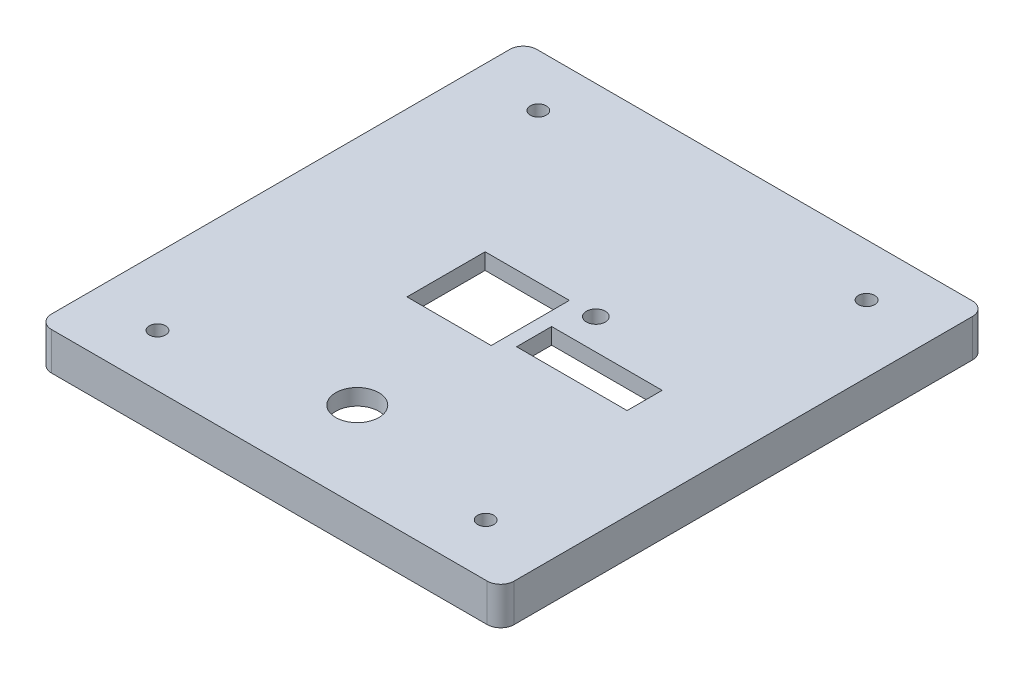
ISO-10303-21;
HEADER;
FILE_DESCRIPTION(('STEP AP214'),'2;1');
FILE_NAME('part.step','',(''),(''),'','','');
FILE_SCHEMA(('AUTOMOTIVE_DESIGN { 1 0 10303 214 1 1 1 1 }'));
ENDSEC;
DATA;
#1=APPLICATION_CONTEXT('core data for automotive mechanical design processes');
#2=APPLICATION_PROTOCOL_DEFINITION('international standard','automotive_design',2000,#1);
#3=PRODUCT_CONTEXT('',#1,'mechanical');
#4=PRODUCT('Part','Part','',(#3));
#5=PRODUCT_RELATED_PRODUCT_CATEGORY('part','',(#4));
#6=PRODUCT_DEFINITION_FORMATION('','',#4);
#7=PRODUCT_DEFINITION_CONTEXT('part definition',#1,'design');
#8=PRODUCT_DEFINITION('design','',#6,#7);
#9=PRODUCT_DEFINITION_SHAPE('','',#8);
#10=(LENGTH_UNIT() NAMED_UNIT(*) SI_UNIT(.MILLI.,.METRE.));
#11=(NAMED_UNIT(*) PLANE_ANGLE_UNIT() SI_UNIT($,.RADIAN.));
#12=(NAMED_UNIT(*) SI_UNIT($,.STERADIAN.) SOLID_ANGLE_UNIT());
#13=UNCERTAINTY_MEASURE_WITH_UNIT(LENGTH_MEASURE(1.E-05),#10,'distance_accuracy_value','');
#14=(GEOMETRIC_REPRESENTATION_CONTEXT(3) GLOBAL_UNCERTAINTY_ASSIGNED_CONTEXT((#13)) GLOBAL_UNIT_ASSIGNED_CONTEXT((#10,
#11,#12)) REPRESENTATION_CONTEXT('',''));
#15=CARTESIAN_POINT('',(0.,0.,0.));
#16=DIRECTION('',(0.,0.,1.));
#17=DIRECTION('',(1.,0.,0.));
#18=AXIS2_PLACEMENT_3D('',#15,#16,#17);
#19=CARTESIAN_POINT('',(0.,4.,0.));
#20=DIRECTION('',(0.,1.,0.));
#21=DIRECTION('',(0.,0.,1.));
#22=AXIS2_PLACEMENT_3D('',#19,#20,#21);
#23=PLANE('',#22);
#24=CARTESIAN_POINT('',(68.7039801841855,4.,-4.81909110229253));
#25=DIRECTION('',(0.,1.,0.));
#26=DIRECTION('',(0.,0.,1.));
#27=AXIS2_PLACEMENT_3D('',#24,#25,#26);
#28=CIRCLE('',#27,1.50000000000001);
#29=CARTESIAN_POINT('',(68.7039801841855,4.,-3.31909110229252));
#30=VERTEX_POINT('',#29);
#31=EDGE_CURVE('E539',#30,#30,#28,.T.);
#32=ORIENTED_EDGE('',*,*,#31,.T.);
#33=EDGE_LOOP('',(#32));
#34=FACE_BOUND('',#33,.T.);
#35=CARTESIAN_POINT('',(7.82598018418551,4.,-75.4570911022925));
#36=DIRECTION('',(0.,1.,0.));
#37=DIRECTION('',(0.,0.,1.));
#38=AXIS2_PLACEMENT_3D('',#35,#36,#37);
#39=CIRCLE('',#38,1.5);
#40=CARTESIAN_POINT('',(7.82598018418551,4.,-73.9570911022925));
#41=VERTEX_POINT('',#40);
#42=EDGE_CURVE('E753',#41,#41,#39,.T.);
#43=ORIENTED_EDGE('',*,*,#42,.T.);
#44=EDGE_LOOP('',(#43));
#45=FACE_BOUND('',#44,.T.);
#46=CARTESIAN_POINT('',(38.353887366001,4.,-11.3565708229402));
#47=DIRECTION('',(0.,1.,0.));
#48=DIRECTION('',(0.,0.,1.));
#49=AXIS2_PLACEMENT_3D('',#46,#47,#48);
#50=CIRCLE('',#49,4.00000000000001);
#51=CARTESIAN_POINT('',(38.353887366001,4.,-7.35657082294016));
#52=VERTEX_POINT('',#51);
#53=EDGE_CURVE('E544',#52,#52,#50,.T.);
#54=ORIENTED_EDGE('',*,*,#53,.T.);
#55=EDGE_LOOP('',(#54));
#56=FACE_BOUND('',#55,.T.);
#57=DIRECTION('',(-1.,0.,0.));
#58=VECTOR('',#57,1.);
#59=CARTESIAN_POINT('',(0.,4.,-47.8380911022925));
#60=LINE('',#59,#58);
#61=CARTESIAN_POINT('',(41.2049801841855,4.,-47.8380911022925));
#62=VERTEX_POINT('',#61);
#63=CARTESIAN_POINT('',(25.5839801841855,4.,-47.8380911022925));
#64=VERTEX_POINT('',#63);
#65=EDGE_CURVE('E240',#62,#64,#60,.T.);
#66=ORIENTED_EDGE('',*,*,#65,.T.);
#67=DIRECTION('',(0.,0.,1.));
#68=VECTOR('',#67,1.);
#69=CARTESIAN_POINT('',(25.5839801841855,4.,0.));
#70=LINE('',#69,#68);
#71=CARTESIAN_POINT('',(25.5839801841855,4.,-33.3380911022925));
#72=VERTEX_POINT('',#71);
#73=EDGE_CURVE('E244',#64,#72,#70,.T.);
#74=ORIENTED_EDGE('',*,*,#73,.T.);
#75=DIRECTION('',(1.,0.,0.));
#76=VECTOR('',#75,1.);
#77=CARTESIAN_POINT('',(0.,4.,-33.3380911022925));
#78=LINE('',#77,#76);
#79=CARTESIAN_POINT('',(41.2049801841855,4.,-33.3380911022925));
#80=VERTEX_POINT('',#79);
#81=EDGE_CURVE('E231',#72,#80,#78,.T.);
#82=ORIENTED_EDGE('',*,*,#81,.T.);
#83=DIRECTION('',(0.,0.,-1.));
#84=VECTOR('',#83,1.);
#85=CARTESIAN_POINT('',(41.2049801841855,4.,0.));
#86=LINE('',#85,#84);
#87=EDGE_CURVE('E206',#80,#62,#86,.T.);
#88=ORIENTED_EDGE('',*,*,#87,.T.);
#89=EDGE_LOOP('',(#66,#74,#82,#88));
#90=FACE_BOUND('',#89,.T.);
#91=CARTESIAN_POINT('',(46.2649801841855,4.,-47.6880911022925));
#92=DIRECTION('',(0.,1.,0.));
#93=DIRECTION('',(0.,0.,1.));
#94=AXIS2_PLACEMENT_3D('',#91,#92,#93);
#95=CIRCLE('',#94,1.75);
#96=CARTESIAN_POINT('',(46.2649801841855,4.,-45.9380911022925));
#97=VERTEX_POINT('',#96);
#98=EDGE_CURVE('E252',#97,#97,#95,.T.);
#99=ORIENTED_EDGE('',*,*,#98,.T.);
#100=EDGE_LOOP('',(#99));
#101=FACE_BOUND('',#100,.T.);
#102=DIRECTION('',(0.,0.,-1.));
#103=VECTOR('',#102,1.);
#104=CARTESIAN_POINT('',(64.2549801841856,4.,-1.371872277833E-13));
#105=LINE('',#104,#103);
#106=CARTESIAN_POINT('',(64.2549801841855,4.,-35.4980911022925));
#107=VERTEX_POINT('',#106);
#108=CARTESIAN_POINT('',(64.2549801841855,4.,-41.9980911022925));
#109=VERTEX_POINT('',#108);
#110=EDGE_CURVE('E292',#107,#109,#105,.T.);
#111=ORIENTED_EDGE('',*,*,#110,.T.);
#112=DIRECTION('',(-1.,0.,0.));
#113=VECTOR('',#112,1.);
#114=CARTESIAN_POINT('',(0.,4.,-41.9980911022925));
#115=LINE('',#114,#113);
#116=CARTESIAN_POINT('',(43.7549801841855,4.,-41.9980911022925));
#117=VERTEX_POINT('',#116);
#118=EDGE_CURVE('E296',#109,#117,#115,.T.);
#119=ORIENTED_EDGE('',*,*,#118,.T.);
#120=DIRECTION('',(0.,0.,1.));
#121=VECTOR('',#120,1.);
#122=CARTESIAN_POINT('',(43.7549801841855,4.,0.));
#123=LINE('',#122,#121);
#124=CARTESIAN_POINT('',(43.7549801841855,4.,-35.4980911022925));
#125=VERTEX_POINT('',#124);
#126=EDGE_CURVE('E275',#117,#125,#123,.T.);
#127=ORIENTED_EDGE('',*,*,#126,.T.);
#128=DIRECTION('',(1.,0.,0.));
#129=VECTOR('',#128,1.);
#130=CARTESIAN_POINT('',(0.,4.,-35.4980911022925));
#131=LINE('',#130,#129);
#132=EDGE_CURVE('E288',#125,#107,#131,.T.);
#133=ORIENTED_EDGE('',*,*,#132,.T.);
#134=EDGE_LOOP('',(#111,#119,#127,#133));
#135=FACE_BOUND('',#134,.T.);
#136=DIRECTION('',(-1.,0.,0.));
#137=VECTOR('',#136,1.);
#138=CARTESIAN_POINT('',(5.62598018418551,4.,-77.8570911022925));
#139=LINE('',#138,#137);
#140=CARTESIAN_POINT('',(70.9039801841855,4.,-77.8570911022925));
#141=VERTEX_POINT('',#140);
#142=CARTESIAN_POINT('',(5.62598018418551,4.,-77.8570911022925));
#143=VERTEX_POINT('',#142);
#144=EDGE_CURVE('E357',#141,#143,#139,.T.);
#145=ORIENTED_EDGE('',*,*,#144,.F.);
#146=DIRECTION('',(0.,0.,-1.));
#147=VECTOR('',#146,1.);
#148=CARTESIAN_POINT('',(70.9039801841855,4.,-77.8570911022925));
#149=LINE('',#148,#147);
#150=CARTESIAN_POINT('',(70.9039801841855,4.,-2.41909110229249));
#151=VERTEX_POINT('',#150);
#152=EDGE_CURVE('E353',#151,#141,#149,.T.);
#153=ORIENTED_EDGE('',*,*,#152,.F.);
#154=DIRECTION('',(1.,0.,0.));
#155=VECTOR('',#154,1.);
#156=CARTESIAN_POINT('',(5.62598018418552,4.,-2.41909110229249));
#157=LINE('',#156,#155);
#158=CARTESIAN_POINT('',(5.62598018418552,4.,-2.41909110229249));
#159=VERTEX_POINT('',#158);
#160=EDGE_CURVE('E366',#159,#151,#157,.T.);
#161=ORIENTED_EDGE('',*,*,#160,.F.);
#162=DIRECTION('',(0.,0.,1.));
#163=VECTOR('',#162,1.);
#164=CARTESIAN_POINT('',(5.62598018418551,4.,-77.8570911022925));
#165=LINE('',#164,#163);
#166=EDGE_CURVE('E362',#143,#159,#165,.T.);
#167=ORIENTED_EDGE('',*,*,#166,.F.);
#168=EDGE_LOOP('',(#145,#153,#161,#167));
#169=FACE_BOUND('',#168,.T.);
#170=CARTESIAN_POINT('',(7.82598018418551,4.,-4.81909110229255));
#171=DIRECTION('',(0.,1.,0.));
#172=DIRECTION('',(0.,0.,1.));
#173=AXIS2_PLACEMENT_3D('',#170,#171,#172);
#174=CIRCLE('',#173,1.5);
#175=CARTESIAN_POINT('',(7.82598018418551,4.,-3.31909110229254));
#176=VERTEX_POINT('',#175);
#177=EDGE_CURVE('E532',#176,#176,#174,.F.);
#178=ORIENTED_EDGE('',*,*,#177,.F.);
#179=EDGE_LOOP('',(#178));
#180=FACE_BOUND('',#179,.T.);
#181=CARTESIAN_POINT('',(68.7039801841855,4.,-75.4570911022925));
#182=DIRECTION('',(0.,1.,0.));
#183=DIRECTION('',(0.,0.,1.));
#184=AXIS2_PLACEMENT_3D('',#181,#182,#183);
#185=CIRCLE('',#184,1.50000000000001);
#186=CARTESIAN_POINT('',(68.7039801841855,4.,-73.9570911022925));
#187=VERTEX_POINT('',#186);
#188=EDGE_CURVE('E535',#187,#187,#185,.F.);
#189=ORIENTED_EDGE('',*,*,#188,.F.);
#190=EDGE_LOOP('',(#189));
#191=FACE_BOUND('',#190,.T.);
#192=ADVANCED_FACE('F39',(#34,#45,#56,#90,#101,#135,#169,#180,#191),#23,.F.);
#193=CARTESIAN_POINT('',(0.,7.,0.));
#194=DIRECTION('',(0.,1.,0.));
#195=DIRECTION('',(0.,0.,1.));
#196=AXIS2_PLACEMENT_3D('',#193,#194,#195);
#197=PLANE('',#196);
#198=CARTESIAN_POINT('',(7.82598018418551,7.,-4.81909110229255));
#199=DIRECTION('',(0.,-1.,0.));
#200=DIRECTION('',(0.,0.,-1.));
#201=AXIS2_PLACEMENT_3D('',#198,#199,#200);
#202=CIRCLE('',#201,1.5);
#203=CARTESIAN_POINT('',(7.82598018418551,7.,-6.31909110229255));
#204=VERTEX_POINT('',#203);
#205=EDGE_CURVE('E745',#204,#204,#202,.T.);
#206=ORIENTED_EDGE('',*,*,#205,.T.);
#207=EDGE_LOOP('',(#206));
#208=FACE_BOUND('',#207,.T.);
#209=CARTESIAN_POINT('',(7.82598018418551,7.,-75.4570911022925));
#210=DIRECTION('',(0.,1.,0.));
#211=DIRECTION('',(0.,0.,1.));
#212=AXIS2_PLACEMENT_3D('',#209,#210,#211);
#213=CIRCLE('',#212,1.5);
#214=CARTESIAN_POINT('',(7.82598018418551,7.,-73.9570911022925));
#215=VERTEX_POINT('',#214);
#216=EDGE_CURVE('E749',#215,#215,#213,.T.);
#217=ORIENTED_EDGE('',*,*,#216,.F.);
#218=EDGE_LOOP('',(#217));
#219=FACE_BOUND('',#218,.T.);
#220=CARTESIAN_POINT('',(38.353887366001,7.,-11.3565708229402));
#221=DIRECTION('',(0.,1.,0.));
#222=DIRECTION('',(0.,0.,1.));
#223=AXIS2_PLACEMENT_3D('',#220,#221,#222);
#224=CIRCLE('',#223,4.00000000000001);
#225=CARTESIAN_POINT('',(38.353887366001,7.,-7.35657082294016));
#226=VERTEX_POINT('',#225);
#227=EDGE_CURVE('E538',#226,#226,#224,.T.);
#228=ORIENTED_EDGE('',*,*,#227,.F.);
#229=EDGE_LOOP('',(#228));
#230=FACE_BOUND('',#229,.T.);
#231=DIRECTION('',(0.,0.,1.));
#232=VECTOR('',#231,1.);
#233=CARTESIAN_POINT('',(25.5839801841855,7.,-33.3380911022925));
#234=LINE('',#233,#232);
#235=CARTESIAN_POINT('',(25.5839801841855,7.,-47.8380911022925));
#236=VERTEX_POINT('',#235);
#237=CARTESIAN_POINT('',(25.5839801841855,7.,-33.3380911022925));
#238=VERTEX_POINT('',#237);
#239=EDGE_CURVE('E63',#236,#238,#234,.T.);
#240=ORIENTED_EDGE('',*,*,#239,.F.);
#241=DIRECTION('',(-1.,0.,0.));
#242=VECTOR('',#241,1.);
#243=CARTESIAN_POINT('',(25.5839801841855,7.,-47.8380911022925));
#244=LINE('',#243,#242);
#245=CARTESIAN_POINT('',(41.2049801841855,7.,-47.8380911022925));
#246=VERTEX_POINT('',#245);
#247=EDGE_CURVE('E221',#246,#236,#244,.T.);
#248=ORIENTED_EDGE('',*,*,#247,.F.);
#249=DIRECTION('',(0.,0.,-1.));
#250=VECTOR('',#249,1.);
#251=CARTESIAN_POINT('',(41.2049801841855,7.,-47.8380911022925));
#252=LINE('',#251,#250);
#253=CARTESIAN_POINT('',(41.2049801841855,7.,-33.3380911022925));
#254=VERTEX_POINT('',#253);
#255=EDGE_CURVE('E203',#254,#246,#252,.T.);
#256=ORIENTED_EDGE('',*,*,#255,.F.);
#257=DIRECTION('',(1.,0.,0.));
#258=VECTOR('',#257,1.);
#259=CARTESIAN_POINT('',(41.2049801841855,7.,-33.3380911022925));
#260=LINE('',#259,#258);
#261=EDGE_CURVE('E213',#238,#254,#260,.T.);
#262=ORIENTED_EDGE('',*,*,#261,.F.);
#263=EDGE_LOOP('',(#240,#248,#256,#262));
#264=FACE_BOUND('',#263,.T.);
#265=CARTESIAN_POINT('',(46.2649801841855,7.,-47.6880911022925));
#266=DIRECTION('',(0.,1.,0.));
#267=DIRECTION('',(0.,0.,1.));
#268=AXIS2_PLACEMENT_3D('',#265,#266,#267);
#269=CIRCLE('',#268,1.75);
#270=CARTESIAN_POINT('',(46.2649801841855,7.,-45.9380911022925));
#271=VERTEX_POINT('',#270);
#272=EDGE_CURVE('E248',#271,#271,#269,.T.);
#273=ORIENTED_EDGE('',*,*,#272,.F.);
#274=EDGE_LOOP('',(#273));
#275=FACE_BOUND('',#274,.T.);
#276=DIRECTION('',(-1.,0.,0.));
#277=VECTOR('',#276,1.);
#278=CARTESIAN_POINT('',(64.2549801841855,7.,-41.9980911022925));
#279=LINE('',#278,#277);
#280=CARTESIAN_POINT('',(64.2549801841855,7.,-41.9980911022925));
#281=VERTEX_POINT('',#280);
#282=CARTESIAN_POINT('',(43.7549801841855,7.,-41.9980911022925));
#283=VERTEX_POINT('',#282);
#284=EDGE_CURVE('E268',#281,#283,#279,.T.);
#285=ORIENTED_EDGE('',*,*,#284,.F.);
#286=DIRECTION('',(0.,0.,-1.));
#287=VECTOR('',#286,1.);
#288=CARTESIAN_POINT('',(64.2549801841855,7.,-41.9980911022925));
#289=LINE('',#288,#287);
#290=CARTESIAN_POINT('',(64.2549801841855,7.,-35.4980911022925));
#291=VERTEX_POINT('',#290);
#292=EDGE_CURVE('E264',#291,#281,#289,.T.);
#293=ORIENTED_EDGE('',*,*,#292,.F.);
#294=DIRECTION('',(1.,0.,0.));
#295=VECTOR('',#294,1.);
#296=CARTESIAN_POINT('',(64.2549801841855,7.,-35.4980911022925));
#297=LINE('',#296,#295);
#298=CARTESIAN_POINT('',(43.7549801841855,7.,-35.4980911022925));
#299=VERTEX_POINT('',#298);
#300=EDGE_CURVE('E260',#299,#291,#297,.T.);
#301=ORIENTED_EDGE('',*,*,#300,.F.);
#302=DIRECTION('',(0.,0.,1.));
#303=VECTOR('',#302,1.);
#304=CARTESIAN_POINT('',(43.7549801841855,7.,-35.4980911022925));
#305=LINE('',#304,#303);
#306=EDGE_CURVE('E256',#283,#299,#305,.T.);
#307=ORIENTED_EDGE('',*,*,#306,.F.);
#308=EDGE_LOOP('',(#285,#293,#301,#307));
#309=FACE_BOUND('',#308,.T.);
#310=DIRECTION('',(0.,0.,-1.));
#311=VECTOR('',#310,1.);
#312=CARTESIAN_POINT('',(81.1649801841855,7.,-85.1380911022925));
#313=LINE('',#312,#311);
#314=CARTESIAN_POINT('',(81.1649801841855,7.,2.36190889770745));
#315=VERTEX_POINT('',#314);
#316=CARTESIAN_POINT('',(81.1649801841855,7.,-82.6380911022925));
#317=VERTEX_POINT('',#316);
#318=EDGE_CURVE('E344',#315,#317,#313,.T.);
#319=ORIENTED_EDGE('',*,*,#318,.T.);
#320=CARTESIAN_POINT('',(78.6649801841855,7.,-82.6380911022925));
#321=DIRECTION('',(0.,1.,0.));
#322=DIRECTION('',(0.,0.,1.));
#323=AXIS2_PLACEMENT_3D('',#320,#321,#322);
#324=CIRCLE('',#323,2.5);
#325=CARTESIAN_POINT('',(78.6649801841855,7.,-85.1380911022925));
#326=VERTEX_POINT('',#325);
#327=EDGE_CURVE('E451',#317,#326,#324,.T.);
#328=ORIENTED_EDGE('',*,*,#327,.T.);
#329=DIRECTION('',(-1.,0.,0.));
#330=VECTOR('',#329,1.);
#331=CARTESIAN_POINT('',(-4.63501981581449,7.,-85.1380911022925));
#332=LINE('',#331,#330);
#333=CARTESIAN_POINT('',(-2.13501981581449,7.,-85.1380911022925));
#334=VERTEX_POINT('',#333);
#335=EDGE_CURVE('E348',#326,#334,#332,.T.);
#336=ORIENTED_EDGE('',*,*,#335,.T.);
#337=CARTESIAN_POINT('',(-2.13501981581449,7.,-82.6380911022925));
#338=DIRECTION('',(0.,1.,0.));
#339=DIRECTION('',(0.,0.,1.));
#340=AXIS2_PLACEMENT_3D('',#337,#338,#339);
#341=CIRCLE('',#340,2.5);
#342=CARTESIAN_POINT('',(-4.63501981581449,7.,-82.6380911022925));
#343=VERTEX_POINT('',#342);
#344=EDGE_CURVE('E448',#334,#343,#341,.T.);
#345=ORIENTED_EDGE('',*,*,#344,.T.);
#346=DIRECTION('',(0.,0.,1.));
#347=VECTOR('',#346,1.);
#348=CARTESIAN_POINT('',(-4.63501981581449,7.,-85.1380911022925));
#349=LINE('',#348,#347);
#350=CARTESIAN_POINT('',(-4.63501981581449,7.,2.36190889770746));
#351=VERTEX_POINT('',#350);
#352=EDGE_CURVE('E325',#343,#351,#349,.T.);
#353=ORIENTED_EDGE('',*,*,#352,.T.);
#354=CARTESIAN_POINT('',(-2.13501981581448,7.,2.36190889770749));
#355=DIRECTION('',(0.,1.,0.));
#356=DIRECTION('',(0.,0.,1.));
#357=AXIS2_PLACEMENT_3D('',#354,#355,#356);
#358=CIRCLE('',#357,2.5);
#359=CARTESIAN_POINT('',(-2.13501981581448,7.,4.86190889770748));
#360=VERTEX_POINT('',#359);
#361=EDGE_CURVE('E442',#351,#360,#358,.T.);
#362=ORIENTED_EDGE('',*,*,#361,.T.);
#363=DIRECTION('',(1.,0.,0.));
#364=VECTOR('',#363,1.);
#365=CARTESIAN_POINT('',(-4.63501981581449,7.,4.86190889770748));
#366=LINE('',#365,#364);
#367=CARTESIAN_POINT('',(78.6649801841855,7.,4.86190889770748));
#368=VERTEX_POINT('',#367);
#369=EDGE_CURVE('E340',#360,#368,#366,.T.);
#370=ORIENTED_EDGE('',*,*,#369,.T.);
#371=CARTESIAN_POINT('',(78.6649801841855,7.,2.36190889770747));
#372=DIRECTION('',(0.,1.,0.));
#373=DIRECTION('',(0.,0.,1.));
#374=AXIS2_PLACEMENT_3D('',#371,#372,#373);
#375=CIRCLE('',#374,2.5);
#376=EDGE_CURVE('E445',#368,#315,#375,.T.);
#377=ORIENTED_EDGE('',*,*,#376,.T.);
#378=EDGE_LOOP('',(#319,#328,#336,#345,#353,#362,#370,#377));
#379=FACE_BOUND('',#378,.T.);
#380=CARTESIAN_POINT('',(68.7039801841855,7.,-4.81909110229253));
#381=DIRECTION('',(0.,1.,0.));
#382=DIRECTION('',(0.,0.,1.));
#383=AXIS2_PLACEMENT_3D('',#380,#381,#382);
#384=CIRCLE('',#383,1.50000000000001);
#385=CARTESIAN_POINT('',(68.7039801841855,7.,-3.31909110229252));
#386=VERTEX_POINT('',#385);
#387=EDGE_CURVE('E741',#386,#386,#384,.T.);
#388=ORIENTED_EDGE('',*,*,#387,.F.);
#389=EDGE_LOOP('',(#388));
#390=FACE_BOUND('',#389,.T.);
#391=CARTESIAN_POINT('',(68.7039801841855,7.,-75.4570911022925));
#392=DIRECTION('',(0.,-1.,0.));
#393=DIRECTION('',(0.,0.,-1.));
#394=AXIS2_PLACEMENT_3D('',#391,#392,#393);
#395=CIRCLE('',#394,1.50000000000001);
#396=CARTESIAN_POINT('',(68.7039801841855,7.,-76.9570911022925));
#397=VERTEX_POINT('',#396);
#398=EDGE_CURVE('E738',#397,#397,#395,.T.);
#399=ORIENTED_EDGE('',*,*,#398,.T.);
#400=EDGE_LOOP('',(#399));
#401=FACE_BOUND('',#400,.T.);
#402=ADVANCED_FACE('F218',(#208,#219,#230,#264,#275,#309,#379,#390,#401),#197,.T.);
#403=CARTESIAN_POINT('',(0.,0.,0.));
#404=DIRECTION('',(0.,1.,0.));
#405=DIRECTION('',(0.,0.,1.));
#406=AXIS2_PLACEMENT_3D('',#403,#404,#405);
#407=PLANE('',#406);
#408=DIRECTION('',(-1.,0.,0.));
#409=VECTOR('',#408,1.);
#410=CARTESIAN_POINT('',(-4.63501981581449,0.,-85.1380911022925));
#411=LINE('',#410,#409);
#412=CARTESIAN_POINT('',(78.6649801841855,0.,-85.1380911022925));
#413=VERTEX_POINT('',#412);
#414=CARTESIAN_POINT('',(69.6970000041855,0.,-85.1380911022925));
#415=VERTEX_POINT('',#414);
#416=EDGE_CURVE('E413',#413,#415,#411,.T.);
#417=ORIENTED_EDGE('',*,*,#416,.F.);
#418=CARTESIAN_POINT('',(78.6649801841855,0.,-82.6380911022925));
#419=DIRECTION('',(0.,1.,0.));
#420=DIRECTION('',(0.,0.,1.));
#421=AXIS2_PLACEMENT_3D('',#418,#419,#420);
#422=CIRCLE('',#421,2.5);
#423=CARTESIAN_POINT('',(81.1649801841855,0.,-82.6380911022925));
#424=VERTEX_POINT('',#423);
#425=EDGE_CURVE('E432',#413,#424,#422,.F.);
#426=ORIENTED_EDGE('',*,*,#425,.T.);
#427=DIRECTION('',(0.,0.,-1.));
#428=VECTOR('',#427,1.);
#429=CARTESIAN_POINT('',(81.1649801841855,0.,-85.1380911022925));
#430=LINE('',#429,#428);
#431=CARTESIAN_POINT('',(81.1649801841855,0.,2.36190889770745));
#432=VERTEX_POINT('',#431);
#433=EDGE_CURVE('E408',#432,#424,#430,.T.);
#434=ORIENTED_EDGE('',*,*,#433,.F.);
#435=CARTESIAN_POINT('',(78.6649801841855,0.,2.36190889770747));
#436=DIRECTION('',(0.,1.,0.));
#437=DIRECTION('',(0.,0.,1.));
#438=AXIS2_PLACEMENT_3D('',#435,#436,#437);
#439=CIRCLE('',#438,2.5);
#440=CARTESIAN_POINT('',(78.6649801841855,0.,4.86190889770748));
#441=VERTEX_POINT('',#440);
#442=EDGE_CURVE('E426',#432,#441,#439,.F.);
#443=ORIENTED_EDGE('',*,*,#442,.T.);
#444=DIRECTION('',(1.,0.,0.));
#445=VECTOR('',#444,1.);
#446=CARTESIAN_POINT('',(-4.63501981581448,0.,4.86190889770749));
#447=LINE('',#446,#445);
#448=CARTESIAN_POINT('',(-2.13501981581448,0.,4.86190889770749));
#449=VERTEX_POINT('',#448);
#450=EDGE_CURVE('E404',#449,#441,#447,.T.);
#451=ORIENTED_EDGE('',*,*,#450,.F.);
#452=CARTESIAN_POINT('',(-2.13501981581448,0.,2.36190889770749));
#453=DIRECTION('',(0.,1.,0.));
#454=DIRECTION('',(0.,0.,1.));
#455=AXIS2_PLACEMENT_3D('',#452,#453,#454);
#456=CIRCLE('',#455,2.5);
#457=CARTESIAN_POINT('',(-4.63501981581448,0.,2.36190889770746));
#458=VERTEX_POINT('',#457);
#459=EDGE_CURVE('E423',#449,#458,#456,.F.);
#460=ORIENTED_EDGE('',*,*,#459,.T.);
#461=DIRECTION('',(0.,0.,1.));
#462=VECTOR('',#461,1.);
#463=CARTESIAN_POINT('',(-4.63501981581449,0.,-85.1380911022925));
#464=LINE('',#463,#462);
#465=CARTESIAN_POINT('',(-4.63501981581449,0.,-82.6380911022925));
#466=VERTEX_POINT('',#465);
#467=EDGE_CURVE('E400',#466,#458,#464,.T.);
#468=ORIENTED_EDGE('',*,*,#467,.F.);
#469=CARTESIAN_POINT('',(-2.13501981581449,0.,-82.6380911022925));
#470=DIRECTION('',(0.,1.,0.));
#471=DIRECTION('',(0.,0.,1.));
#472=AXIS2_PLACEMENT_3D('',#469,#470,#471);
#473=CIRCLE('',#472,2.5);
#474=CARTESIAN_POINT('',(-2.13501981581449,0.,-85.1380911022925));
#475=VERTEX_POINT('',#474);
#476=EDGE_CURVE('E429',#466,#475,#473,.F.);
#477=ORIENTED_EDGE('',*,*,#476,.T.);
#478=CARTESIAN_POINT('',(54.2970000041855,0.,-85.1380911022925));
#479=VERTEX_POINT('',#478);
#480=EDGE_CURVE('E412',#479,#475,#411,.T.);
#481=ORIENTED_EDGE('',*,*,#480,.F.);
#482=DIRECTION('',(0.,0.,-1.));
#483=VECTOR('',#482,1.);
#484=CARTESIAN_POINT('',(54.2970000041855,0.,-85.1380911022925));
#485=LINE('',#484,#483);
#486=CARTESIAN_POINT('',(54.2970000041855,0.,-77.8570911022925));
#487=VERTEX_POINT('',#486);
#488=EDGE_CURVE('E300',#487,#479,#485,.T.);
#489=ORIENTED_EDGE('',*,*,#488,.F.);
#490=DIRECTION('',(-1.,0.,0.));
#491=VECTOR('',#490,1.);
#492=CARTESIAN_POINT('',(5.62598018418551,0.,-77.8570911022925));
#493=LINE('',#492,#491);
#494=CARTESIAN_POINT('',(5.62598018418551,0.,-77.8570911022925));
#495=VERTEX_POINT('',#494);
#496=EDGE_CURVE('E374',#487,#495,#493,.T.);
#497=ORIENTED_EDGE('',*,*,#496,.T.);
#498=DIRECTION('',(0.,0.,1.));
#499=VECTOR('',#498,1.);
#500=CARTESIAN_POINT('',(5.62598018418551,0.,-77.8570911022925));
#501=LINE('',#500,#499);
#502=CARTESIAN_POINT('',(5.62598018418552,0.,-2.41909110229249));
#503=VERTEX_POINT('',#502);
#504=EDGE_CURVE('E379',#495,#503,#501,.T.);
#505=ORIENTED_EDGE('',*,*,#504,.T.);
#506=DIRECTION('',(1.,0.,0.));
#507=VECTOR('',#506,1.);
#508=CARTESIAN_POINT('',(5.62598018418552,0.,-2.41909110229249));
#509=LINE('',#508,#507);
#510=CARTESIAN_POINT('',(70.9039801841855,0.,-2.41909110229249));
#511=VERTEX_POINT('',#510);
#512=EDGE_CURVE('E358',#503,#511,#509,.T.);
#513=ORIENTED_EDGE('',*,*,#512,.T.);
#514=DIRECTION('',(0.,0.,-1.));
#515=VECTOR('',#514,1.);
#516=CARTESIAN_POINT('',(70.9039801841855,0.,-77.8570911022925));
#517=LINE('',#516,#515);
#518=CARTESIAN_POINT('',(70.9039801841855,0.,-77.8570911022925));
#519=VERTEX_POINT('',#518);
#520=EDGE_CURVE('E352',#511,#519,#517,.T.);
#521=ORIENTED_EDGE('',*,*,#520,.T.);
#522=CARTESIAN_POINT('',(69.6970000041855,0.,-77.8570911022925));
#523=VERTEX_POINT('',#522);
#524=EDGE_CURVE('E375',#519,#523,#493,.T.);
#525=ORIENTED_EDGE('',*,*,#524,.T.);
#526=DIRECTION('',(0.,0.,1.));
#527=VECTOR('',#526,1.);
#528=CARTESIAN_POINT('',(69.6970000041855,0.,-85.1380911022925));
#529=LINE('',#528,#527);
#530=EDGE_CURVE('E306',#415,#523,#529,.T.);
#531=ORIENTED_EDGE('',*,*,#530,.F.);
#532=EDGE_LOOP('',(#417,#426,#434,#443,#451,#460,#468,#477,#481,#489,#497,#505,#513,#521,#525,#531));
#533=FACE_BOUND('',#532,.T.);
#534=ADVANCED_FACE('F472',(#533),#407,.F.);
#535=CARTESIAN_POINT('',(-4.63501981581449,4.,-85.1380911022925));
#536=DIRECTION('',(1.,0.,0.));
#537=DIRECTION('',(0.,0.,-1.));
#538=AXIS2_PLACEMENT_3D('',#535,#536,#537);
#539=PLANE('',#538);
#540=ORIENTED_EDGE('',*,*,#352,.F.);
#541=DIRECTION('',(0.,-1.,0.));
#542=VECTOR('',#541,1.);
#543=CARTESIAN_POINT('',(-4.63501981581449,4.,-82.6380911022925));
#544=LINE('',#543,#542);
#545=EDGE_CURVE('E457',#343,#466,#544,.T.);
#546=ORIENTED_EDGE('',*,*,#545,.T.);
#547=ORIENTED_EDGE('',*,*,#467,.T.);
#548=DIRECTION('',(0.,-1.,0.));
#549=VECTOR('',#548,1.);
#550=CARTESIAN_POINT('',(-4.63501981581448,4.,2.36190889770749));
#551=LINE('',#550,#549);
#552=EDGE_CURVE('E454',#458,#351,#551,.F.);
#553=ORIENTED_EDGE('',*,*,#552,.T.);
#554=EDGE_LOOP('',(#540,#546,#547,#553));
#555=FACE_BOUND('',#554,.T.);
#556=ADVANCED_FACE('F621',(#555),#539,.F.);
#557=CARTESIAN_POINT('',(-4.63501981581448,4.,4.86190889770749));
#558=DIRECTION('',(0.,0.,-1.));
#559=DIRECTION('',(-1.,0.,0.));
#560=AXIS2_PLACEMENT_3D('',#557,#558,#559);
#561=PLANE('',#560);
#562=ORIENTED_EDGE('',*,*,#450,.T.);
#563=DIRECTION('',(0.,-1.,0.));
#564=VECTOR('',#563,1.);
#565=CARTESIAN_POINT('',(78.6649801841855,4.,4.86190889770748));
#566=LINE('',#565,#564);
#567=EDGE_CURVE('E11',#441,#368,#566,.F.);
#568=ORIENTED_EDGE('',*,*,#567,.T.);
#569=ORIENTED_EDGE('',*,*,#369,.F.);
#570=DIRECTION('',(0.,-1.,0.));
#571=VECTOR('',#570,1.);
#572=CARTESIAN_POINT('',(-2.13501981581448,4.,4.86190889770749));
#573=LINE('',#572,#571);
#574=EDGE_CURVE('E48',#360,#449,#573,.T.);
#575=ORIENTED_EDGE('',*,*,#574,.T.);
#576=EDGE_LOOP('',(#562,#568,#569,#575));
#577=FACE_BOUND('',#576,.T.);
#578=ADVANCED_FACE('F466',(#577),#561,.F.);
#579=CARTESIAN_POINT('',(81.1649801841855,4.,-85.1380911022925));
#580=DIRECTION('',(-1.,0.,0.));
#581=DIRECTION('',(0.,0.,1.));
#582=AXIS2_PLACEMENT_3D('',#579,#580,#581);
#583=PLANE('',#582);
#584=ORIENTED_EDGE('',*,*,#433,.T.);
#585=DIRECTION('',(0.,-1.,0.));
#586=VECTOR('',#585,1.);
#587=CARTESIAN_POINT('',(81.1649801841855,4.,-82.6380911022925));
#588=LINE('',#587,#586);
#589=EDGE_CURVE('E439',#424,#317,#588,.F.);
#590=ORIENTED_EDGE('',*,*,#589,.T.);
#591=ORIENTED_EDGE('',*,*,#318,.F.);
#592=DIRECTION('',(0.,-1.,0.));
#593=VECTOR('',#592,1.);
#594=CARTESIAN_POINT('',(81.1649801841855,4.,2.36190889770747));
#595=LINE('',#594,#593);
#596=EDGE_CURVE('E435',#315,#432,#595,.T.);
#597=ORIENTED_EDGE('',*,*,#596,.T.);
#598=EDGE_LOOP('',(#584,#590,#591,#597));
#599=FACE_BOUND('',#598,.T.);
#600=ADVANCED_FACE('F481',(#599),#583,.F.);
#601=CARTESIAN_POINT('',(-4.63501981581449,4.,-85.1380911022925));
#602=DIRECTION('',(0.,0.,1.));
#603=DIRECTION('',(1.,0.,0.));
#604=AXIS2_PLACEMENT_3D('',#601,#602,#603);
#605=PLANE('',#604);
#606=ORIENTED_EDGE('',*,*,#335,.F.);
#607=DIRECTION('',(0.,-1.,0.));
#608=VECTOR('',#607,1.);
#609=CARTESIAN_POINT('',(78.6649801841855,4.,-85.1380911022925));
#610=LINE('',#609,#608);
#611=EDGE_CURVE('E419',#326,#413,#610,.T.);
#612=ORIENTED_EDGE('',*,*,#611,.T.);
#613=ORIENTED_EDGE('',*,*,#416,.T.);
#614=DIRECTION('',(0.,-1.,0.));
#615=VECTOR('',#614,1.);
#616=CARTESIAN_POINT('',(69.6970000041855,3.,-85.1380911022925));
#617=LINE('',#616,#615);
#618=CARTESIAN_POINT('',(69.6970000041855,3.,-85.1380911022925));
#619=VERTEX_POINT('',#618);
#620=EDGE_CURVE('E330',#619,#415,#617,.T.);
#621=ORIENTED_EDGE('',*,*,#620,.F.);
#622=DIRECTION('',(1.,0.,0.));
#623=VECTOR('',#622,1.);
#624=CARTESIAN_POINT('',(69.6970000041855,3.,-85.1380911022925));
#625=LINE('',#624,#623);
#626=CARTESIAN_POINT('',(54.2970000041855,3.,-85.1380911022925));
#627=VERTEX_POINT('',#626);
#628=EDGE_CURVE('E305',#627,#619,#625,.T.);
#629=ORIENTED_EDGE('',*,*,#628,.F.);
#630=DIRECTION('',(0.,-1.,0.));
#631=VECTOR('',#630,1.);
#632=CARTESIAN_POINT('',(54.2970000041855,3.,-85.1380911022925));
#633=LINE('',#632,#631);
#634=EDGE_CURVE('E317',#627,#479,#633,.T.);
#635=ORIENTED_EDGE('',*,*,#634,.T.);
#636=ORIENTED_EDGE('',*,*,#480,.T.);
#637=DIRECTION('',(0.,-1.,0.));
#638=VECTOR('',#637,1.);
#639=CARTESIAN_POINT('',(-2.13501981581449,4.,-85.1380911022925));
#640=LINE('',#639,#638);
#641=EDGE_CURVE('E416',#475,#334,#640,.F.);
#642=ORIENTED_EDGE('',*,*,#641,.T.);
#643=EDGE_LOOP('',(#606,#612,#613,#621,#629,#635,#636,#642));
#644=FACE_BOUND('',#643,.T.);
#645=ADVANCED_FACE('F491',(#644),#605,.F.);
#646=CARTESIAN_POINT('',(70.9039801841855,4.,-77.8570911022925));
#647=DIRECTION('',(-1.,0.,0.));
#648=DIRECTION('',(0.,0.,1.));
#649=AXIS2_PLACEMENT_3D('',#646,#647,#648);
#650=PLANE('',#649);
#651=ORIENTED_EDGE('',*,*,#520,.F.);
#652=DIRECTION('',(0.,-1.,0.));
#653=VECTOR('',#652,1.);
#654=CARTESIAN_POINT('',(70.9039801841855,4.,-2.41909110229249));
#655=LINE('',#654,#653);
#656=EDGE_CURVE('E370',#151,#511,#655,.T.);
#657=ORIENTED_EDGE('',*,*,#656,.F.);
#658=ORIENTED_EDGE('',*,*,#152,.T.);
#659=DIRECTION('',(0.,-1.,0.));
#660=VECTOR('',#659,1.);
#661=CARTESIAN_POINT('',(70.9039801841855,4.,-77.8570911022925));
#662=LINE('',#661,#660);
#663=EDGE_CURVE('E396',#141,#519,#662,.T.);
#664=ORIENTED_EDGE('',*,*,#663,.T.);
#665=EDGE_LOOP('',(#651,#657,#658,#664));
#666=FACE_BOUND('',#665,.T.);
#667=ADVANCED_FACE('F523',(#666),#650,.T.);
#668=CARTESIAN_POINT('',(5.62598018418551,4.,-77.8570911022925));
#669=DIRECTION('',(0.,0.,1.));
#670=DIRECTION('',(1.,0.,0.));
#671=AXIS2_PLACEMENT_3D('',#668,#669,#670);
#672=PLANE('',#671);
#673=DIRECTION('',(0.,-1.,0.));
#674=VECTOR('',#673,1.);
#675=CARTESIAN_POINT('',(54.2970000041855,3.,-77.8570911022925));
#676=LINE('',#675,#674);
#677=CARTESIAN_POINT('',(54.2970000041855,3.,-77.8570911022925));
#678=VERTEX_POINT('',#677);
#679=EDGE_CURVE('E322',#678,#487,#676,.T.);
#680=ORIENTED_EDGE('',*,*,#679,.F.);
#681=DIRECTION('',(-1.,0.,0.));
#682=VECTOR('',#681,1.);
#683=CARTESIAN_POINT('',(54.2970000041855,3.,-77.8570911022925));
#684=LINE('',#683,#682);
#685=CARTESIAN_POINT('',(69.6970000041855,3.,-77.8570911022925));
#686=VERTEX_POINT('',#685);
#687=EDGE_CURVE('E313',#686,#678,#684,.T.);
#688=ORIENTED_EDGE('',*,*,#687,.F.);
#689=DIRECTION('',(0.,-1.,0.));
#690=VECTOR('',#689,1.);
#691=CARTESIAN_POINT('',(69.6970000041855,3.,-77.8570911022925));
#692=LINE('',#691,#690);
#693=EDGE_CURVE('E326',#686,#523,#692,.T.);
#694=ORIENTED_EDGE('',*,*,#693,.T.);
#695=ORIENTED_EDGE('',*,*,#524,.F.);
#696=ORIENTED_EDGE('',*,*,#663,.F.);
#697=ORIENTED_EDGE('',*,*,#144,.T.);
#698=DIRECTION('',(0.,-1.,0.));
#699=VECTOR('',#698,1.);
#700=CARTESIAN_POINT('',(5.62598018418551,4.,-77.8570911022925));
#701=LINE('',#700,#699);
#702=EDGE_CURVE('E392',#143,#495,#701,.T.);
#703=ORIENTED_EDGE('',*,*,#702,.T.);
#704=ORIENTED_EDGE('',*,*,#496,.F.);
#705=EDGE_LOOP('',(#680,#688,#694,#695,#696,#697,#703,#704));
#706=FACE_BOUND('',#705,.T.);
#707=ADVANCED_FACE('F500',(#706),#672,.T.);
#708=CARTESIAN_POINT('',(5.62598018418551,4.,-77.8570911022925));
#709=DIRECTION('',(1.,0.,0.));
#710=DIRECTION('',(0.,0.,-1.));
#711=AXIS2_PLACEMENT_3D('',#708,#709,#710);
#712=PLANE('',#711);
#713=ORIENTED_EDGE('',*,*,#504,.F.);
#714=ORIENTED_EDGE('',*,*,#702,.F.);
#715=ORIENTED_EDGE('',*,*,#166,.T.);
#716=DIRECTION('',(0.,-1.,0.));
#717=VECTOR('',#716,1.);
#718=CARTESIAN_POINT('',(5.62598018418552,4.,-2.41909110229249));
#719=LINE('',#718,#717);
#720=EDGE_CURVE('E389',#159,#503,#719,.T.);
#721=ORIENTED_EDGE('',*,*,#720,.T.);
#722=EDGE_LOOP('',(#713,#714,#715,#721));
#723=FACE_BOUND('',#722,.T.);
#724=ADVANCED_FACE('F516',(#723),#712,.T.);
#725=CARTESIAN_POINT('',(5.62598018418552,4.,-2.41909110229249));
#726=DIRECTION('',(0.,0.,-1.));
#727=DIRECTION('',(-1.,0.,0.));
#728=AXIS2_PLACEMENT_3D('',#725,#726,#727);
#729=PLANE('',#728);
#730=ORIENTED_EDGE('',*,*,#512,.F.);
#731=ORIENTED_EDGE('',*,*,#720,.F.);
#732=ORIENTED_EDGE('',*,*,#160,.T.);
#733=ORIENTED_EDGE('',*,*,#656,.T.);
#734=EDGE_LOOP('',(#730,#731,#732,#733));
#735=FACE_BOUND('',#734,.T.);
#736=ADVANCED_FACE('F520',(#735),#729,.T.);
#737=CARTESIAN_POINT('',(54.2970000041855,3.,-85.1380911022925));
#738=DIRECTION('',(-1.,0.,0.));
#739=DIRECTION('',(0.,0.,1.));
#740=AXIS2_PLACEMENT_3D('',#737,#738,#739);
#741=PLANE('',#740);
#742=ORIENTED_EDGE('',*,*,#488,.T.);
#743=ORIENTED_EDGE('',*,*,#634,.F.);
#744=DIRECTION('',(0.,0.,-1.));
#745=VECTOR('',#744,1.);
#746=CARTESIAN_POINT('',(54.2970000041855,3.,-85.1380911022925));
#747=LINE('',#746,#745);
#748=EDGE_CURVE('E301',#678,#627,#747,.T.);
#749=ORIENTED_EDGE('',*,*,#748,.F.);
#750=ORIENTED_EDGE('',*,*,#679,.T.);
#751=EDGE_LOOP('',(#742,#743,#749,#750));
#752=FACE_BOUND('',#751,.T.);
#753=ADVANCED_FACE('F605',(#752),#741,.F.);
#754=CARTESIAN_POINT('',(69.6970000041855,3.,-85.1380911022925));
#755=DIRECTION('',(1.,0.,0.));
#756=DIRECTION('',(0.,0.,-1.));
#757=AXIS2_PLACEMENT_3D('',#754,#755,#756);
#758=PLANE('',#757);
#759=ORIENTED_EDGE('',*,*,#530,.T.);
#760=ORIENTED_EDGE('',*,*,#693,.F.);
#761=DIRECTION('',(0.,0.,1.));
#762=VECTOR('',#761,1.);
#763=CARTESIAN_POINT('',(69.6970000041855,3.,-85.1380911022925));
#764=LINE('',#763,#762);
#765=EDGE_CURVE('E310',#619,#686,#764,.T.);
#766=ORIENTED_EDGE('',*,*,#765,.F.);
#767=ORIENTED_EDGE('',*,*,#620,.T.);
#768=EDGE_LOOP('',(#759,#760,#766,#767));
#769=FACE_BOUND('',#768,.T.);
#770=ADVANCED_FACE('F496',(#769),#758,.F.);
#771=CARTESIAN_POINT('',(0.,3.,0.));
#772=DIRECTION('',(0.,1.,0.));
#773=DIRECTION('',(0.,0.,1.));
#774=AXIS2_PLACEMENT_3D('',#771,#772,#773);
#775=PLANE('',#774);
#776=ORIENTED_EDGE('',*,*,#748,.T.);
#777=ORIENTED_EDGE('',*,*,#628,.T.);
#778=ORIENTED_EDGE('',*,*,#765,.T.);
#779=ORIENTED_EDGE('',*,*,#687,.T.);
#780=EDGE_LOOP('',(#776,#777,#778,#779));
#781=FACE_BOUND('',#780,.T.);
#782=ADVANCED_FACE('F504',(#781),#775,.F.);
#783=CARTESIAN_POINT('',(78.6649801841855,4.,-82.6380911022925));
#784=DIRECTION('',(0.,-1.,0.));
#785=DIRECTION('',(0.,0.,-1.));
#786=AXIS2_PLACEMENT_3D('',#783,#784,#785);
#787=CYLINDRICAL_SURFACE('',#786,2.5);
#788=ORIENTED_EDGE('',*,*,#327,.F.);
#789=ORIENTED_EDGE('',*,*,#589,.F.);
#790=ORIENTED_EDGE('',*,*,#425,.F.);
#791=ORIENTED_EDGE('',*,*,#611,.F.);
#792=EDGE_LOOP('',(#788,#789,#790,#791));
#793=FACE_BOUND('',#792,.T.);
#794=ADVANCED_FACE('F489',(#793),#787,.T.);
#795=CARTESIAN_POINT('',(-2.13501981581449,4.,-82.6380911022925));
#796=DIRECTION('',(0.,-1.,0.));
#797=DIRECTION('',(0.,0.,-1.));
#798=AXIS2_PLACEMENT_3D('',#795,#796,#797);
#799=CYLINDRICAL_SURFACE('',#798,2.5);
#800=ORIENTED_EDGE('',*,*,#344,.F.);
#801=ORIENTED_EDGE('',*,*,#641,.F.);
#802=ORIENTED_EDGE('',*,*,#476,.F.);
#803=ORIENTED_EDGE('',*,*,#545,.F.);
#804=EDGE_LOOP('',(#800,#801,#802,#803));
#805=FACE_BOUND('',#804,.T.);
#806=ADVANCED_FACE('F633',(#805),#799,.T.);
#807=CARTESIAN_POINT('',(78.6649801841855,4.,2.36190889770747));
#808=DIRECTION('',(0.,-1.,0.));
#809=DIRECTION('',(0.,0.,-1.));
#810=AXIS2_PLACEMENT_3D('',#807,#808,#809);
#811=CYLINDRICAL_SURFACE('',#810,2.5);
#812=ORIENTED_EDGE('',*,*,#376,.F.);
#813=ORIENTED_EDGE('',*,*,#567,.F.);
#814=ORIENTED_EDGE('',*,*,#442,.F.);
#815=ORIENTED_EDGE('',*,*,#596,.F.);
#816=EDGE_LOOP('',(#812,#813,#814,#815));
#817=FACE_BOUND('',#816,.T.);
#818=ADVANCED_FACE('F478',(#817),#811,.T.);
#819=CARTESIAN_POINT('',(-2.13501981581448,4.,2.36190889770749));
#820=DIRECTION('',(0.,-1.,0.));
#821=DIRECTION('',(0.,0.,-1.));
#822=AXIS2_PLACEMENT_3D('',#819,#820,#821);
#823=CYLINDRICAL_SURFACE('',#822,2.5);
#824=ORIENTED_EDGE('',*,*,#361,.F.);
#825=ORIENTED_EDGE('',*,*,#552,.F.);
#826=ORIENTED_EDGE('',*,*,#459,.F.);
#827=ORIENTED_EDGE('',*,*,#574,.F.);
#828=EDGE_LOOP('',(#824,#825,#826,#827));
#829=FACE_BOUND('',#828,.T.);
#830=ADVANCED_FACE('F41',(#829),#823,.T.);
#831=CARTESIAN_POINT('',(64.2549801841855,0.,-41.9980911022925));
#832=DIRECTION('',(0.,0.,-1.));
#833=DIRECTION('',(-1.,0.,0.));
#834=AXIS2_PLACEMENT_3D('',#831,#832,#833);
#835=PLANE('',#834);
#836=DIRECTION('',(0.,1.,0.));
#837=VECTOR('',#836,1.);
#838=CARTESIAN_POINT('',(64.2549801841855,0.,-41.9980911022925));
#839=LINE('',#838,#837);
#840=EDGE_CURVE('E272',#109,#281,#839,.T.);
#841=ORIENTED_EDGE('',*,*,#840,.T.);
#842=ORIENTED_EDGE('',*,*,#284,.T.);
#843=DIRECTION('',(0.,1.,0.));
#844=VECTOR('',#843,1.);
#845=CARTESIAN_POINT('',(43.7549801841855,0.,-41.9980911022925));
#846=LINE('',#845,#844);
#847=EDGE_CURVE('E271',#117,#283,#846,.T.);
#848=ORIENTED_EDGE('',*,*,#847,.F.);
#849=ORIENTED_EDGE('',*,*,#118,.F.);
#850=EDGE_LOOP('',(#841,#842,#848,#849));
#851=FACE_BOUND('',#850,.T.);
#852=ADVANCED_FACE('F586',(#851),#835,.F.);
#853=CARTESIAN_POINT('',(64.2549801841855,0.,-41.9980911022925));
#854=DIRECTION('',(1.,0.,0.));
#855=DIRECTION('',(0.,0.,-1.));
#856=AXIS2_PLACEMENT_3D('',#853,#854,#855);
#857=PLANE('',#856);
#858=DIRECTION('',(0.,1.,0.));
#859=VECTOR('',#858,1.);
#860=CARTESIAN_POINT('',(64.2549801841855,0.,-35.4980911022925));
#861=LINE('',#860,#859);
#862=EDGE_CURVE('E276',#107,#291,#861,.T.);
#863=ORIENTED_EDGE('',*,*,#862,.T.);
#864=ORIENTED_EDGE('',*,*,#292,.T.);
#865=ORIENTED_EDGE('',*,*,#840,.F.);
#866=ORIENTED_EDGE('',*,*,#110,.F.);
#867=EDGE_LOOP('',(#863,#864,#865,#866));
#868=FACE_BOUND('',#867,.T.);
#869=ADVANCED_FACE('F589',(#868),#857,.F.);
#870=CARTESIAN_POINT('',(64.2549801841855,0.,-35.4980911022925));
#871=DIRECTION('',(0.,0.,1.));
#872=DIRECTION('',(1.,0.,0.));
#873=AXIS2_PLACEMENT_3D('',#870,#871,#872);
#874=PLANE('',#873);
#875=DIRECTION('',(0.,1.,0.));
#876=VECTOR('',#875,1.);
#877=CARTESIAN_POINT('',(43.7549801841855,0.,-35.4980911022925));
#878=LINE('',#877,#876);
#879=EDGE_CURVE('E279',#125,#299,#878,.T.);
#880=ORIENTED_EDGE('',*,*,#879,.T.);
#881=ORIENTED_EDGE('',*,*,#300,.T.);
#882=ORIENTED_EDGE('',*,*,#862,.F.);
#883=ORIENTED_EDGE('',*,*,#132,.F.);
#884=EDGE_LOOP('',(#880,#881,#882,#883));
#885=FACE_BOUND('',#884,.T.);
#886=ADVANCED_FACE('F593',(#885),#874,.F.);
#887=CARTESIAN_POINT('',(43.7549801841855,0.,-35.4980911022925));
#888=DIRECTION('',(-1.,0.,0.));
#889=DIRECTION('',(0.,0.,1.));
#890=AXIS2_PLACEMENT_3D('',#887,#888,#889);
#891=PLANE('',#890);
#892=ORIENTED_EDGE('',*,*,#847,.T.);
#893=ORIENTED_EDGE('',*,*,#306,.T.);
#894=ORIENTED_EDGE('',*,*,#879,.F.);
#895=ORIENTED_EDGE('',*,*,#126,.F.);
#896=EDGE_LOOP('',(#892,#893,#894,#895));
#897=FACE_BOUND('',#896,.T.);
#898=ADVANCED_FACE('F584',(#897),#891,.F.);
#899=CARTESIAN_POINT('',(46.2649801841855,0.,-47.6880911022925));
#900=DIRECTION('',(0.,1.,0.));
#901=DIRECTION('',(0.,0.,1.));
#902=AXIS2_PLACEMENT_3D('',#899,#900,#901);
#903=CYLINDRICAL_SURFACE('',#902,1.75);
#904=ORIENTED_EDGE('',*,*,#272,.T.);
#905=EDGE_LOOP('',(#904));
#906=FACE_BOUND('',#905,.T.);
#907=ORIENTED_EDGE('',*,*,#98,.F.);
#908=EDGE_LOOP('',(#907));
#909=FACE_BOUND('',#908,.T.);
#910=ADVANCED_FACE('F581',(#906,#909),#903,.F.);
#911=CARTESIAN_POINT('',(25.5839801841855,0.,-33.3380911022925));
#912=DIRECTION('',(-1.,0.,0.));
#913=DIRECTION('',(0.,0.,1.));
#914=AXIS2_PLACEMENT_3D('',#911,#912,#913);
#915=PLANE('',#914);
#916=DIRECTION('',(0.,1.,0.));
#917=VECTOR('',#916,1.);
#918=CARTESIAN_POINT('',(25.5839801841855,0.,-47.8380911022925));
#919=LINE('',#918,#917);
#920=EDGE_CURVE('E228',#64,#236,#919,.T.);
#921=ORIENTED_EDGE('',*,*,#920,.T.);
#922=ORIENTED_EDGE('',*,*,#239,.T.);
#923=DIRECTION('',(0.,1.,0.));
#924=VECTOR('',#923,1.);
#925=CARTESIAN_POINT('',(25.5839801841855,0.,-33.3380911022925));
#926=LINE('',#925,#924);
#927=EDGE_CURVE('E210',#72,#238,#926,.T.);
#928=ORIENTED_EDGE('',*,*,#927,.F.);
#929=ORIENTED_EDGE('',*,*,#73,.F.);
#930=EDGE_LOOP('',(#921,#922,#928,#929));
#931=FACE_BOUND('',#930,.T.);
#932=ADVANCED_FACE('F575',(#931),#915,.F.);
#933=CARTESIAN_POINT('',(25.5839801841855,0.,-47.8380911022925));
#934=DIRECTION('',(0.,0.,-1.));
#935=DIRECTION('',(-1.,0.,0.));
#936=AXIS2_PLACEMENT_3D('',#933,#934,#935);
#937=PLANE('',#936);
#938=DIRECTION('',(0.,1.,0.));
#939=VECTOR('',#938,1.);
#940=CARTESIAN_POINT('',(41.2049801841855,0.,-47.8380911022925));
#941=LINE('',#940,#939);
#942=EDGE_CURVE('E209',#62,#246,#941,.T.);
#943=ORIENTED_EDGE('',*,*,#942,.T.);
#944=ORIENTED_EDGE('',*,*,#247,.T.);
#945=ORIENTED_EDGE('',*,*,#920,.F.);
#946=ORIENTED_EDGE('',*,*,#65,.F.);
#947=EDGE_LOOP('',(#943,#944,#945,#946));
#948=FACE_BOUND('',#947,.T.);
#949=ADVANCED_FACE('F572',(#948),#937,.F.);
#950=CARTESIAN_POINT('',(41.2049801841855,0.,-47.8380911022925));
#951=DIRECTION('',(1.,0.,0.));
#952=DIRECTION('',(0.,0.,-1.));
#953=AXIS2_PLACEMENT_3D('',#950,#951,#952);
#954=PLANE('',#953);
#955=DIRECTION('',(0.,1.,0.));
#956=VECTOR('',#955,1.);
#957=CARTESIAN_POINT('',(41.2049801841855,0.,-33.3380911022925));
#958=LINE('',#957,#956);
#959=EDGE_CURVE('E55',#80,#254,#958,.T.);
#960=ORIENTED_EDGE('',*,*,#959,.T.);
#961=ORIENTED_EDGE('',*,*,#255,.T.);
#962=ORIENTED_EDGE('',*,*,#942,.F.);
#963=ORIENTED_EDGE('',*,*,#87,.F.);
#964=EDGE_LOOP('',(#960,#961,#962,#963));
#965=FACE_BOUND('',#964,.T.);
#966=ADVANCED_FACE('F200',(#965),#954,.F.);
#967=CARTESIAN_POINT('',(41.2049801841855,0.,-33.3380911022925));
#968=DIRECTION('',(0.,0.,1.));
#969=DIRECTION('',(1.,0.,0.));
#970=AXIS2_PLACEMENT_3D('',#967,#968,#969);
#971=PLANE('',#970);
#972=ORIENTED_EDGE('',*,*,#927,.T.);
#973=ORIENTED_EDGE('',*,*,#261,.T.);
#974=ORIENTED_EDGE('',*,*,#959,.F.);
#975=ORIENTED_EDGE('',*,*,#81,.F.);
#976=EDGE_LOOP('',(#972,#973,#974,#975));
#977=FACE_BOUND('',#976,.T.);
#978=ADVANCED_FACE('F214',(#977),#971,.F.);
#979=CARTESIAN_POINT('',(38.353887366001,0.,-11.3565708229402));
#980=DIRECTION('',(0.,1.,0.));
#981=DIRECTION('',(0.,0.,1.));
#982=AXIS2_PLACEMENT_3D('',#979,#980,#981);
#983=CYLINDRICAL_SURFACE('',#982,4.00000000000001);
#984=ORIENTED_EDGE('',*,*,#227,.T.);
#985=EDGE_LOOP('',(#984));
#986=FACE_BOUND('',#985,.T.);
#987=ORIENTED_EDGE('',*,*,#53,.F.);
#988=EDGE_LOOP('',(#987));
#989=FACE_BOUND('',#988,.T.);
#990=ADVANCED_FACE('F557',(#986,#989),#983,.F.);
#991=CARTESIAN_POINT('',(7.82598018418551,-3.,-75.4570911022925));
#992=DIRECTION('',(0.,1.,0.));
#993=DIRECTION('',(0.,0.,1.));
#994=AXIS2_PLACEMENT_3D('',#991,#992,#993);
#995=CYLINDRICAL_SURFACE('',#994,1.5);
#996=ORIENTED_EDGE('',*,*,#216,.T.);
#997=EDGE_LOOP('',(#996));
#998=FACE_BOUND('',#997,.T.);
#999=ORIENTED_EDGE('',*,*,#42,.F.);
#1000=EDGE_LOOP('',(#999));
#1001=FACE_BOUND('',#1000,.T.);
#1002=ADVANCED_FACE('F559',(#998,#1001),#995,.F.);
#1003=CARTESIAN_POINT('',(7.82598018418551,-3.,-4.81909110229255));
#1004=DIRECTION('',(0.,1.,0.));
#1005=DIRECTION('',(0.,0.,1.));
#1006=AXIS2_PLACEMENT_3D('',#1003,#1004,#1005);
#1007=CYLINDRICAL_SURFACE('',#1006,1.5);
#1008=ORIENTED_EDGE('',*,*,#205,.F.);
#1009=EDGE_LOOP('',(#1008));
#1010=FACE_BOUND('',#1009,.T.);
#1011=ORIENTED_EDGE('',*,*,#177,.T.);
#1012=EDGE_LOOP('',(#1011));
#1013=FACE_BOUND('',#1012,.T.);
#1014=ADVANCED_FACE('F566',(#1010,#1013),#1007,.F.);
#1015=CARTESIAN_POINT('',(68.7039801841855,-3.,-4.81909110229253));
#1016=DIRECTION('',(0.,1.,0.));
#1017=DIRECTION('',(0.,0.,1.));
#1018=AXIS2_PLACEMENT_3D('',#1015,#1016,#1017);
#1019=CYLINDRICAL_SURFACE('',#1018,1.50000000000001);
#1020=ORIENTED_EDGE('',*,*,#387,.T.);
#1021=EDGE_LOOP('',(#1020));
#1022=FACE_BOUND('',#1021,.T.);
#1023=ORIENTED_EDGE('',*,*,#31,.F.);
#1024=EDGE_LOOP('',(#1023));
#1025=FACE_BOUND('',#1024,.T.);
#1026=ADVANCED_FACE('F713',(#1022,#1025),#1019,.F.);
#1027=CARTESIAN_POINT('',(68.7039801841855,-3.,-75.4570911022925));
#1028=DIRECTION('',(0.,1.,0.));
#1029=DIRECTION('',(0.,0.,1.));
#1030=AXIS2_PLACEMENT_3D('',#1027,#1028,#1029);
#1031=CYLINDRICAL_SURFACE('',#1030,1.50000000000001);
#1032=ORIENTED_EDGE('',*,*,#398,.F.);
#1033=EDGE_LOOP('',(#1032));
#1034=FACE_BOUND('',#1033,.T.);
#1035=ORIENTED_EDGE('',*,*,#188,.T.);
#1036=EDGE_LOOP('',(#1035));
#1037=FACE_BOUND('',#1036,.T.);
#1038=ADVANCED_FACE('F723',(#1034,#1037),#1031,.F.);
#1039=CLOSED_SHELL('',(#192,#402,#534,#556,#578,#600,#645,#667,#707,#724,#736,#753,#770,#782,
#794,#806,#818,#830,#852,#869,#886,#898,#910,#932,#949,#966,#978,#990,#1002,#1014,#1026,#1038));
#1040=MANIFOLD_SOLID_BREP('B2',#1039);
#1041=ADVANCED_BREP_SHAPE_REPRESENTATION('',(#18,#1040),#14);
#1042=SHAPE_DEFINITION_REPRESENTATION(#9,#1041);
ENDSEC;
END-ISO-10303-21;
